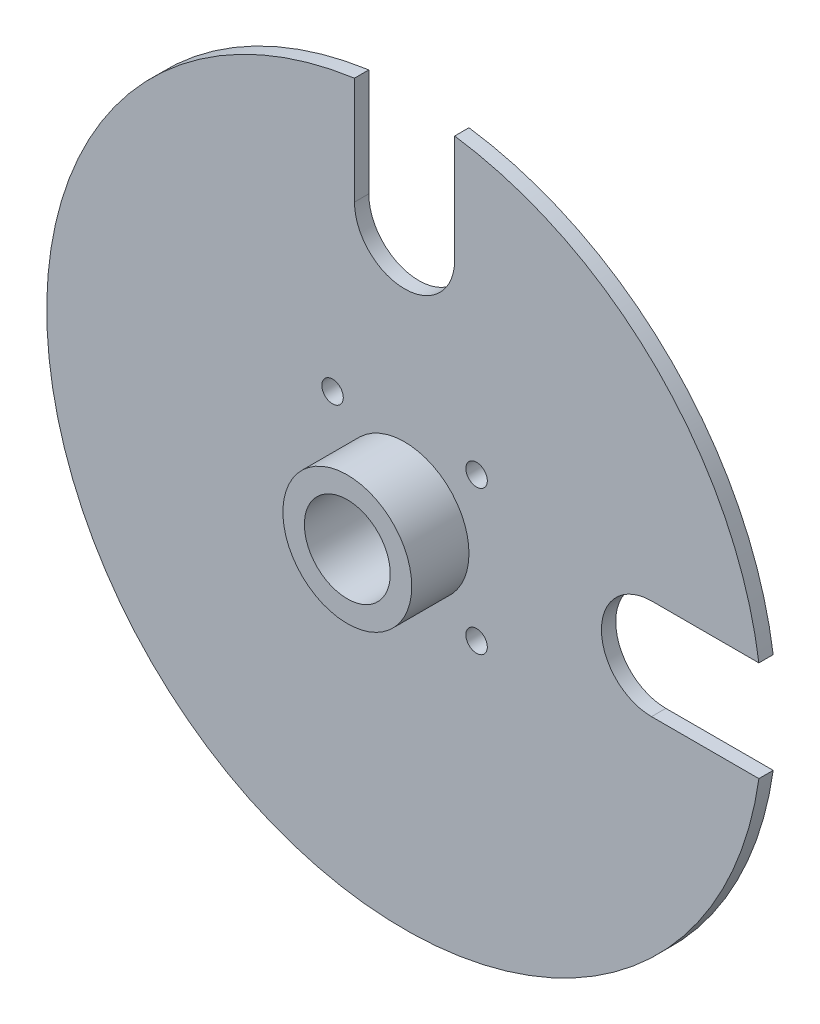
ISO-10303-21;
HEADER;
FILE_DESCRIPTION(('STEP AP214'),'2;1');
FILE_NAME('part.step','',(''),(''),'','','');
FILE_SCHEMA(('AUTOMOTIVE_DESIGN { 1 0 10303 214 1 1 1 1 }'));
ENDSEC;
DATA;
#1=APPLICATION_CONTEXT('core data for automotive mechanical design processes');
#2=APPLICATION_PROTOCOL_DEFINITION('international standard','automotive_design',2000,#1);
#3=PRODUCT_CONTEXT('',#1,'mechanical');
#4=PRODUCT('Part','Part','',(#3));
#5=PRODUCT_RELATED_PRODUCT_CATEGORY('part','',(#4));
#6=PRODUCT_DEFINITION_FORMATION('','',#4);
#7=PRODUCT_DEFINITION_CONTEXT('part definition',#1,'design');
#8=PRODUCT_DEFINITION('design','',#6,#7);
#9=PRODUCT_DEFINITION_SHAPE('','',#8);
#10=(LENGTH_UNIT() NAMED_UNIT(*) SI_UNIT(.MILLI.,.METRE.));
#11=(NAMED_UNIT(*) PLANE_ANGLE_UNIT() SI_UNIT($,.RADIAN.));
#12=(NAMED_UNIT(*) SI_UNIT($,.STERADIAN.) SOLID_ANGLE_UNIT());
#13=UNCERTAINTY_MEASURE_WITH_UNIT(LENGTH_MEASURE(1.E-05),#10,'distance_accuracy_value','');
#14=(GEOMETRIC_REPRESENTATION_CONTEXT(3) GLOBAL_UNCERTAINTY_ASSIGNED_CONTEXT((#13)) GLOBAL_UNIT_ASSIGNED_CONTEXT((#10,
#11,#12)) REPRESENTATION_CONTEXT('',''));
#15=CARTESIAN_POINT('',(0.,0.,0.));
#16=DIRECTION('',(0.,0.,1.));
#17=DIRECTION('',(1.,0.,0.));
#18=AXIS2_PLACEMENT_3D('',#15,#16,#17);
#19=CARTESIAN_POINT('',(0.,0.,7.));
#20=DIRECTION('',(0.,0.,-1.));
#21=DIRECTION('',(-1.,0.,0.));
#22=AXIS2_PLACEMENT_3D('',#19,#20,#21);
#23=CYLINDRICAL_SURFACE('',#22,50.);
#24=CARTESIAN_POINT('',(0.,0.,5.));
#25=DIRECTION('',(0.,0.,1.));
#26=DIRECTION('',(1.,0.,0.));
#27=AXIS2_PLACEMENT_3D('',#24,#25,#26);
#28=CIRCLE('',#27,50.);
#29=CARTESIAN_POINT('',(-7.,49.5075751779463,5.));
#30=VERTEX_POINT('',#29);
#31=CARTESIAN_POINT('',(49.5075751779447,-7.00000000001074,5.));
#32=VERTEX_POINT('',#31);
#33=EDGE_CURVE('E124',#30,#32,#28,.T.);
#34=ORIENTED_EDGE('',*,*,#33,.T.);
#35=DIRECTION('',(0.,0.,1.));
#36=VECTOR('',#35,1.);
#37=CARTESIAN_POINT('',(49.5075751779447,-7.00000000001074,5.));
#38=LINE('',#37,#36);
#39=CARTESIAN_POINT('',(49.5075751779447,-7.00000000001074,7.));
#40=VERTEX_POINT('',#39);
#41=EDGE_CURVE('E200',#32,#40,#38,.T.);
#42=ORIENTED_EDGE('',*,*,#41,.T.);
#43=CARTESIAN_POINT('',(0.,0.,7.));
#44=DIRECTION('',(0.,0.,1.));
#45=DIRECTION('',(1.,0.,0.));
#46=AXIS2_PLACEMENT_3D('',#43,#44,#45);
#47=CIRCLE('',#46,50.);
#48=CARTESIAN_POINT('',(-7.,49.5075751779463,7.));
#49=VERTEX_POINT('',#48);
#50=EDGE_CURVE('E132',#49,#40,#47,.T.);
#51=ORIENTED_EDGE('',*,*,#50,.F.);
#52=DIRECTION('',(0.,0.,1.));
#53=VECTOR('',#52,1.);
#54=CARTESIAN_POINT('',(-7.,49.5075751779463,5.));
#55=LINE('',#54,#53);
#56=EDGE_CURVE('E58',#30,#49,#55,.T.);
#57=ORIENTED_EDGE('',*,*,#56,.F.);
#58=EDGE_LOOP('',(#34,#42,#51,#57));
#59=FACE_BOUND('',#58,.T.);
#60=ADVANCED_FACE('F33',(#59),#23,.T.);
#61=CARTESIAN_POINT('',(0.,0.,0.));
#62=DIRECTION('',(0.,0.,1.));
#63=DIRECTION('',(1.,0.,0.));
#64=AXIS2_PLACEMENT_3D('',#61,#62,#63);
#65=PLANE('',#64);
#66=CARTESIAN_POINT('',(0.,0.,0.));
#67=DIRECTION('',(0.,0.,1.));
#68=DIRECTION('',(1.,0.,0.));
#69=AXIS2_PLACEMENT_3D('',#66,#67,#68);
#70=CIRCLE('',#69,20.);
#71=CARTESIAN_POINT('',(20.,0.,0.));
#72=VERTEX_POINT('',#71);
#73=EDGE_CURVE('E42',#72,#72,#70,.T.);
#74=ORIENTED_EDGE('',*,*,#73,.F.);
#75=EDGE_LOOP('',(#74));
#76=FACE_BOUND('',#75,.T.);
#77=CARTESIAN_POINT('',(0.,0.,0.));
#78=DIRECTION('',(0.,0.,1.));
#79=DIRECTION('',(1.,0.,0.));
#80=AXIS2_PLACEMENT_3D('',#77,#78,#79);
#81=CIRCLE('',#80,6.);
#82=CARTESIAN_POINT('',(6.,0.,0.));
#83=VERTEX_POINT('',#82);
#84=EDGE_CURVE('E152',#83,#83,#81,.T.);
#85=ORIENTED_EDGE('',*,*,#84,.T.);
#86=EDGE_LOOP('',(#85));
#87=FACE_BOUND('',#86,.T.);
#88=CARTESIAN_POINT('',(-10.0619514030223,10.0619514030222,0.));
#89=DIRECTION('',(0.,0.,1.));
#90=DIRECTION('',(1.,0.,0.));
#91=AXIS2_PLACEMENT_3D('',#88,#89,#90);
#92=CIRCLE('',#91,1.5);
#93=CARTESIAN_POINT('',(-8.56195140302228,10.0619514030222,0.));
#94=VERTEX_POINT('',#93);
#95=EDGE_CURVE('E149',#94,#94,#92,.T.);
#96=ORIENTED_EDGE('',*,*,#95,.T.);
#97=EDGE_LOOP('',(#96));
#98=FACE_BOUND('',#97,.T.);
#99=CARTESIAN_POINT('',(10.0619514030223,10.0619514030222,0.));
#100=DIRECTION('',(0.,0.,1.));
#101=DIRECTION('',(-1.,0.,0.));
#102=AXIS2_PLACEMENT_3D('',#99,#100,#101);
#103=CIRCLE('',#102,1.5);
#104=CARTESIAN_POINT('',(8.56195140302228,10.0619514030222,0.));
#105=VERTEX_POINT('',#104);
#106=EDGE_CURVE('E146',#105,#105,#103,.T.);
#107=ORIENTED_EDGE('',*,*,#106,.T.);
#108=EDGE_LOOP('',(#107));
#109=FACE_BOUND('',#108,.T.);
#110=CARTESIAN_POINT('',(10.0619514030223,-10.0619514030222,0.));
#111=DIRECTION('',(0.,0.,1.));
#112=DIRECTION('',(1.,0.,0.));
#113=AXIS2_PLACEMENT_3D('',#110,#111,#112);
#114=CIRCLE('',#113,1.5);
#115=CARTESIAN_POINT('',(11.5619514030223,-10.0619514030222,0.));
#116=VERTEX_POINT('',#115);
#117=EDGE_CURVE('E143',#116,#116,#114,.T.);
#118=ORIENTED_EDGE('',*,*,#117,.T.);
#119=EDGE_LOOP('',(#118));
#120=FACE_BOUND('',#119,.T.);
#121=CARTESIAN_POINT('',(-10.0619514030223,-10.0619514030222,0.));
#122=DIRECTION('',(0.,0.,1.));
#123=DIRECTION('',(-1.,0.,0.));
#124=AXIS2_PLACEMENT_3D('',#121,#122,#123);
#125=CIRCLE('',#124,1.5);
#126=CARTESIAN_POINT('',(-11.5619514030223,-10.0619514030222,0.));
#127=VERTEX_POINT('',#126);
#128=EDGE_CURVE('E140',#127,#127,#125,.T.);
#129=ORIENTED_EDGE('',*,*,#128,.T.);
#130=EDGE_LOOP('',(#129));
#131=FACE_BOUND('',#130,.T.);
#132=ADVANCED_FACE('F158',(#76,#87,#98,#109,#120,#131),#65,.F.);
#133=CARTESIAN_POINT('',(0.,0.,5.));
#134=DIRECTION('',(0.,0.,-1.));
#135=DIRECTION('',(-1.,0.,0.));
#136=AXIS2_PLACEMENT_3D('',#133,#134,#135);
#137=CYLINDRICAL_SURFACE('',#136,20.);
#138=CARTESIAN_POINT('',(0.,0.,5.));
#139=DIRECTION('',(0.,0.,1.));
#140=DIRECTION('',(1.,0.,0.));
#141=AXIS2_PLACEMENT_3D('',#138,#139,#140);
#142=CIRCLE('',#141,20.);
#143=CARTESIAN_POINT('',(20.,0.,5.));
#144=VERTEX_POINT('',#143);
#145=EDGE_CURVE('E11',#144,#144,#142,.T.);
#146=ORIENTED_EDGE('',*,*,#145,.F.);
#147=EDGE_LOOP('',(#146));
#148=FACE_BOUND('',#147,.T.);
#149=ORIENTED_EDGE('',*,*,#73,.T.);
#150=EDGE_LOOP('',(#149));
#151=FACE_BOUND('',#150,.T.);
#152=ADVANCED_FACE('F35',(#148,#151),#137,.T.);
#153=CARTESIAN_POINT('',(0.,0.,5.));
#154=DIRECTION('',(0.,0.,-1.));
#155=DIRECTION('',(-1.,0.,0.));
#156=AXIS2_PLACEMENT_3D('',#153,#154,#155);
#157=CYLINDRICAL_SURFACE('',#156,6.);
#158=CARTESIAN_POINT('',(0.,0.,15.));
#159=DIRECTION('',(0.,0.,1.));
#160=DIRECTION('',(1.,0.,0.));
#161=AXIS2_PLACEMENT_3D('',#158,#159,#160);
#162=CIRCLE('',#161,6.);
#163=CARTESIAN_POINT('',(6.,0.,15.));
#164=VERTEX_POINT('',#163);
#165=EDGE_CURVE('E134',#164,#164,#162,.T.);
#166=ORIENTED_EDGE('',*,*,#165,.T.);
#167=EDGE_LOOP('',(#166));
#168=FACE_BOUND('',#167,.T.);
#169=ORIENTED_EDGE('',*,*,#84,.F.);
#170=EDGE_LOOP('',(#169));
#171=FACE_BOUND('',#170,.T.);
#172=ADVANCED_FACE('F275',(#168,#171),#157,.F.);
#173=CARTESIAN_POINT('',(-10.0619514030223,10.0619514030222,5.));
#174=DIRECTION('',(0.,0.,-1.));
#175=DIRECTION('',(-1.,0.,0.));
#176=AXIS2_PLACEMENT_3D('',#173,#174,#175);
#177=CYLINDRICAL_SURFACE('',#176,1.5);
#178=ORIENTED_EDGE('',*,*,#95,.F.);
#179=EDGE_LOOP('',(#178));
#180=FACE_BOUND('',#179,.T.);
#181=CARTESIAN_POINT('',(-10.0619514030223,10.0619514030222,7.));
#182=DIRECTION('',(0.,0.,1.));
#183=DIRECTION('',(1.,0.,0.));
#184=AXIS2_PLACEMENT_3D('',#181,#182,#183);
#185=CIRCLE('',#184,1.5);
#186=CARTESIAN_POINT('',(-8.56195140302228,10.0619514030222,7.));
#187=VERTEX_POINT('',#186);
#188=EDGE_CURVE('E188',#187,#187,#185,.T.);
#189=ORIENTED_EDGE('',*,*,#188,.T.);
#190=EDGE_LOOP('',(#189));
#191=FACE_BOUND('',#190,.T.);
#192=ADVANCED_FACE('F271',(#180,#191),#177,.F.);
#193=CARTESIAN_POINT('',(10.0619514030223,10.0619514030222,5.));
#194=DIRECTION('',(0.,0.,-1.));
#195=DIRECTION('',(-1.,0.,0.));
#196=AXIS2_PLACEMENT_3D('',#193,#194,#195);
#197=CYLINDRICAL_SURFACE('',#196,1.5);
#198=ORIENTED_EDGE('',*,*,#106,.F.);
#199=EDGE_LOOP('',(#198));
#200=FACE_BOUND('',#199,.T.);
#201=CARTESIAN_POINT('',(10.0619514030223,10.0619514030222,7.));
#202=DIRECTION('',(0.,0.,1.));
#203=DIRECTION('',(1.,0.,0.));
#204=AXIS2_PLACEMENT_3D('',#201,#202,#203);
#205=CIRCLE('',#204,1.5);
#206=CARTESIAN_POINT('',(11.5619514030223,10.0619514030222,7.));
#207=VERTEX_POINT('',#206);
#208=EDGE_CURVE('E181',#207,#207,#205,.T.);
#209=ORIENTED_EDGE('',*,*,#208,.T.);
#210=EDGE_LOOP('',(#209));
#211=FACE_BOUND('',#210,.T.);
#212=ADVANCED_FACE('F267',(#200,#211),#197,.F.);
#213=CARTESIAN_POINT('',(10.0619514030223,-10.0619514030222,5.));
#214=DIRECTION('',(0.,0.,-1.));
#215=DIRECTION('',(-1.,0.,0.));
#216=AXIS2_PLACEMENT_3D('',#213,#214,#215);
#217=CYLINDRICAL_SURFACE('',#216,1.5);
#218=ORIENTED_EDGE('',*,*,#117,.F.);
#219=EDGE_LOOP('',(#218));
#220=FACE_BOUND('',#219,.T.);
#221=CARTESIAN_POINT('',(10.0619514030223,-10.0619514030222,7.));
#222=DIRECTION('',(0.,0.,1.));
#223=DIRECTION('',(1.,0.,0.));
#224=AXIS2_PLACEMENT_3D('',#221,#222,#223);
#225=CIRCLE('',#224,1.5);
#226=CARTESIAN_POINT('',(11.5619514030223,-10.0619514030222,7.));
#227=VERTEX_POINT('',#226);
#228=EDGE_CURVE('E182',#227,#227,#225,.T.);
#229=ORIENTED_EDGE('',*,*,#228,.T.);
#230=EDGE_LOOP('',(#229));
#231=FACE_BOUND('',#230,.T.);
#232=ADVANCED_FACE('F175',(#220,#231),#217,.F.);
#233=CARTESIAN_POINT('',(-10.0619514030223,-10.0619514030222,5.));
#234=DIRECTION('',(0.,0.,-1.));
#235=DIRECTION('',(-1.,0.,0.));
#236=AXIS2_PLACEMENT_3D('',#233,#234,#235);
#237=CYLINDRICAL_SURFACE('',#236,1.5);
#238=ORIENTED_EDGE('',*,*,#128,.F.);
#239=EDGE_LOOP('',(#238));
#240=FACE_BOUND('',#239,.T.);
#241=CARTESIAN_POINT('',(-10.0619514030223,-10.0619514030222,7.));
#242=DIRECTION('',(0.,0.,1.));
#243=DIRECTION('',(1.,0.,0.));
#244=AXIS2_PLACEMENT_3D('',#241,#242,#243);
#245=CIRCLE('',#244,1.5);
#246=CARTESIAN_POINT('',(-8.56195140302228,-10.0619514030222,7.));
#247=VERTEX_POINT('',#246);
#248=EDGE_CURVE('E179',#247,#247,#245,.T.);
#249=ORIENTED_EDGE('',*,*,#248,.T.);
#250=EDGE_LOOP('',(#249));
#251=FACE_BOUND('',#250,.T.);
#252=ADVANCED_FACE('F171',(#240,#251),#237,.F.);
#253=CARTESIAN_POINT('',(0.,0.,15.));
#254=DIRECTION('',(0.,0.,1.));
#255=DIRECTION('',(1.,0.,0.));
#256=AXIS2_PLACEMENT_3D('',#253,#254,#255);
#257=PLANE('',#256);
#258=CARTESIAN_POINT('',(0.,0.,15.));
#259=DIRECTION('',(0.,0.,1.));
#260=DIRECTION('',(1.,0.,0.));
#261=AXIS2_PLACEMENT_3D('',#258,#259,#260);
#262=CIRCLE('',#261,9.);
#263=CARTESIAN_POINT('',(9.,0.,15.));
#264=VERTEX_POINT('',#263);
#265=EDGE_CURVE('E137',#264,#264,#262,.T.);
#266=ORIENTED_EDGE('',*,*,#265,.T.);
#267=EDGE_LOOP('',(#266));
#268=FACE_BOUND('',#267,.T.);
#269=ORIENTED_EDGE('',*,*,#165,.F.);
#270=EDGE_LOOP('',(#269));
#271=FACE_BOUND('',#270,.T.);
#272=ADVANCED_FACE('F174',(#268,#271),#257,.T.);
#273=CARTESIAN_POINT('',(0.,0.,15.));
#274=DIRECTION('',(0.,0.,-1.));
#275=DIRECTION('',(-1.,0.,0.));
#276=AXIS2_PLACEMENT_3D('',#273,#274,#275);
#277=CYLINDRICAL_SURFACE('',#276,9.);
#278=CARTESIAN_POINT('',(0.,0.,7.));
#279=DIRECTION('',(0.,0.,1.));
#280=DIRECTION('',(1.,0.,0.));
#281=AXIS2_PLACEMENT_3D('',#278,#279,#280);
#282=CIRCLE('',#281,9.);
#283=CARTESIAN_POINT('',(9.,0.,7.));
#284=VERTEX_POINT('',#283);
#285=EDGE_CURVE('E37',#284,#284,#282,.T.);
#286=ORIENTED_EDGE('',*,*,#285,.T.);
#287=EDGE_LOOP('',(#286));
#288=FACE_BOUND('',#287,.T.);
#289=ORIENTED_EDGE('',*,*,#265,.F.);
#290=EDGE_LOOP('',(#289));
#291=FACE_BOUND('',#290,.T.);
#292=ADVANCED_FACE('F241',(#288,#291),#277,.T.);
#293=CARTESIAN_POINT('',(0.,0.,5.));
#294=DIRECTION('',(0.,0.,1.));
#295=DIRECTION('',(1.,0.,0.));
#296=AXIS2_PLACEMENT_3D('',#293,#294,#295);
#297=PLANE('',#296);
#298=ORIENTED_EDGE('',*,*,#145,.T.);
#299=EDGE_LOOP('',(#298));
#300=FACE_BOUND('',#299,.T.);
#301=CARTESIAN_POINT('',(34.5075751779463,-7.4804405753469E-12,5.));
#302=DIRECTION('',(0.,0.,1.));
#303=DIRECTION('',(1.,0.,0.));
#304=AXIS2_PLACEMENT_3D('',#301,#302,#303);
#305=CIRCLE('',#304,7.);
#306=CARTESIAN_POINT('',(34.5075751779478,6.99999999999252,5.));
#307=VERTEX_POINT('',#306);
#308=CARTESIAN_POINT('',(34.5075751779447,-7.00000000000748,5.));
#309=VERTEX_POINT('',#308);
#310=EDGE_CURVE('E107',#307,#309,#305,.T.);
#311=ORIENTED_EDGE('',*,*,#310,.T.);
#312=DIRECTION('',(1.,-2.17013906844699E-13,0.));
#313=VECTOR('',#312,1.);
#314=CARTESIAN_POINT('',(49.5075751779447,-7.00000000001074,5.));
#315=LINE('',#314,#313);
#316=EDGE_CURVE('E117',#309,#32,#315,.T.);
#317=ORIENTED_EDGE('',*,*,#316,.T.);
#318=ORIENTED_EDGE('',*,*,#33,.F.);
#319=DIRECTION('',(0.,-1.,0.));
#320=VECTOR('',#319,1.);
#321=CARTESIAN_POINT('',(-7.,49.5075751779463,5.));
#322=LINE('',#321,#320);
#323=CARTESIAN_POINT('',(-7.,34.5075751779463,5.));
#324=VERTEX_POINT('',#323);
#325=EDGE_CURVE('E207',#30,#324,#322,.T.);
#326=ORIENTED_EDGE('',*,*,#325,.T.);
#327=CARTESIAN_POINT('',(0.,34.5075751779463,5.));
#328=DIRECTION('',(0.,0.,1.));
#329=DIRECTION('',(1.,0.,0.));
#330=AXIS2_PLACEMENT_3D('',#327,#328,#329);
#331=CIRCLE('',#330,7.);
#332=CARTESIAN_POINT('',(6.99999999999999,34.5075751779463,5.));
#333=VERTEX_POINT('',#332);
#334=EDGE_CURVE('E210',#324,#333,#331,.T.);
#335=ORIENTED_EDGE('',*,*,#334,.T.);
#336=DIRECTION('',(0.,1.,0.));
#337=VECTOR('',#336,1.);
#338=CARTESIAN_POINT('',(7.,49.5075751779463,5.));
#339=LINE('',#338,#337);
#340=CARTESIAN_POINT('',(7.,49.5075751779463,5.));
#341=VERTEX_POINT('',#340);
#342=EDGE_CURVE('E123',#333,#341,#339,.T.);
#343=ORIENTED_EDGE('',*,*,#342,.T.);
#344=CARTESIAN_POINT('',(49.5075751779478,6.99999999998926,5.));
#345=VERTEX_POINT('',#344);
#346=EDGE_CURVE('E114',#345,#341,#28,.T.);
#347=ORIENTED_EDGE('',*,*,#346,.F.);
#348=DIRECTION('',(-1.,2.16782610381235E-13,0.));
#349=VECTOR('',#348,1.);
#350=CARTESIAN_POINT('',(49.5075751779478,6.99999999998926,5.));
#351=LINE('',#350,#349);
#352=EDGE_CURVE('E100',#345,#307,#351,.T.);
#353=ORIENTED_EDGE('',*,*,#352,.T.);
#354=EDGE_LOOP('',(#311,#317,#318,#326,#335,#343,#347,#353));
#355=FACE_BOUND('',#354,.T.);
#356=ADVANCED_FACE('F120',(#300,#355),#297,.F.);
#357=CARTESIAN_POINT('',(49.5075751779478,6.99999999998926,7.));
#358=VERTEX_POINT('',#357);
#359=CARTESIAN_POINT('',(7.,49.5075751779463,7.));
#360=VERTEX_POINT('',#359);
#361=EDGE_CURVE('E116',#358,#360,#47,.T.);
#362=ORIENTED_EDGE('',*,*,#361,.F.);
#363=DIRECTION('',(0.,0.,1.));
#364=VECTOR('',#363,1.);
#365=CARTESIAN_POINT('',(49.5075751779478,6.99999999998926,5.));
#366=LINE('',#365,#364);
#367=EDGE_CURVE('E50',#345,#358,#366,.T.);
#368=ORIENTED_EDGE('',*,*,#367,.F.);
#369=ORIENTED_EDGE('',*,*,#346,.T.);
#370=DIRECTION('',(0.,0.,1.));
#371=VECTOR('',#370,1.);
#372=CARTESIAN_POINT('',(7.,49.5075751779463,5.));
#373=LINE('',#372,#371);
#374=EDGE_CURVE('E125',#341,#360,#373,.T.);
#375=ORIENTED_EDGE('',*,*,#374,.T.);
#376=EDGE_LOOP('',(#362,#368,#369,#375));
#377=FACE_BOUND('',#376,.T.);
#378=ADVANCED_FACE('F112',(#377),#23,.T.);
#379=CARTESIAN_POINT('',(0.,0.,7.));
#380=DIRECTION('',(0.,0.,1.));
#381=DIRECTION('',(1.,0.,0.));
#382=AXIS2_PLACEMENT_3D('',#379,#380,#381);
#383=PLANE('',#382);
#384=ORIENTED_EDGE('',*,*,#228,.F.);
#385=EDGE_LOOP('',(#384));
#386=FACE_BOUND('',#385,.T.);
#387=ORIENTED_EDGE('',*,*,#188,.F.);
#388=EDGE_LOOP('',(#387));
#389=FACE_BOUND('',#388,.T.);
#390=ORIENTED_EDGE('',*,*,#248,.F.);
#391=EDGE_LOOP('',(#390));
#392=FACE_BOUND('',#391,.T.);
#393=ORIENTED_EDGE('',*,*,#208,.F.);
#394=EDGE_LOOP('',(#393));
#395=FACE_BOUND('',#394,.T.);
#396=DIRECTION('',(1.,-2.17013906844699E-13,0.));
#397=VECTOR('',#396,1.);
#398=CARTESIAN_POINT('',(49.5075751779447,-7.00000000001074,7.));
#399=LINE('',#398,#397);
#400=CARTESIAN_POINT('',(34.5075751779447,-7.00000000000748,7.));
#401=VERTEX_POINT('',#400);
#402=EDGE_CURVE('E108',#401,#40,#399,.T.);
#403=ORIENTED_EDGE('',*,*,#402,.F.);
#404=CARTESIAN_POINT('',(34.5075751779463,-7.4804405753469E-12,7.));
#405=DIRECTION('',(0.,0.,1.));
#406=DIRECTION('',(1.,0.,0.));
#407=AXIS2_PLACEMENT_3D('',#404,#405,#406);
#408=CIRCLE('',#407,7.);
#409=CARTESIAN_POINT('',(34.5075751779478,6.99999999999252,7.));
#410=VERTEX_POINT('',#409);
#411=EDGE_CURVE('E196',#410,#401,#408,.T.);
#412=ORIENTED_EDGE('',*,*,#411,.F.);
#413=DIRECTION('',(-1.,2.16782610381235E-13,0.));
#414=VECTOR('',#413,1.);
#415=CARTESIAN_POINT('',(49.5075751779478,6.99999999998926,7.));
#416=LINE('',#415,#414);
#417=EDGE_CURVE('E185',#358,#410,#416,.T.);
#418=ORIENTED_EDGE('',*,*,#417,.F.);
#419=ORIENTED_EDGE('',*,*,#361,.T.);
#420=DIRECTION('',(0.,1.,0.));
#421=VECTOR('',#420,1.);
#422=CARTESIAN_POINT('',(7.,49.5075751779463,7.));
#423=LINE('',#422,#421);
#424=CARTESIAN_POINT('',(6.99999999999999,34.5075751779463,7.));
#425=VERTEX_POINT('',#424);
#426=EDGE_CURVE('E211',#425,#360,#423,.T.);
#427=ORIENTED_EDGE('',*,*,#426,.F.);
#428=CARTESIAN_POINT('',(0.,34.5075751779463,7.));
#429=DIRECTION('',(0.,0.,1.));
#430=DIRECTION('',(1.,0.,0.));
#431=AXIS2_PLACEMENT_3D('',#428,#429,#430);
#432=CIRCLE('',#431,7.);
#433=CARTESIAN_POINT('',(-7.,34.5075751779463,7.));
#434=VERTEX_POINT('',#433);
#435=EDGE_CURVE('E215',#434,#425,#432,.T.);
#436=ORIENTED_EDGE('',*,*,#435,.F.);
#437=DIRECTION('',(0.,-1.,0.));
#438=VECTOR('',#437,1.);
#439=CARTESIAN_POINT('',(-7.,49.5075751779463,7.));
#440=LINE('',#439,#438);
#441=EDGE_CURVE('E203',#49,#434,#440,.T.);
#442=ORIENTED_EDGE('',*,*,#441,.F.);
#443=ORIENTED_EDGE('',*,*,#50,.T.);
#444=EDGE_LOOP('',(#403,#412,#418,#419,#427,#436,#442,#443));
#445=FACE_BOUND('',#444,.T.);
#446=ORIENTED_EDGE('',*,*,#285,.F.);
#447=EDGE_LOOP('',(#446));
#448=FACE_BOUND('',#447,.T.);
#449=ADVANCED_FACE('F232',(#386,#389,#392,#395,#445,#448),#383,.T.);
#450=CARTESIAN_POINT('',(7.,49.5075751779463,5.));
#451=DIRECTION('',(1.,0.,0.));
#452=DIRECTION('',(0.,1.,0.));
#453=AXIS2_PLACEMENT_3D('',#450,#451,#452);
#454=PLANE('',#453);
#455=ORIENTED_EDGE('',*,*,#426,.T.);
#456=ORIENTED_EDGE('',*,*,#374,.F.);
#457=ORIENTED_EDGE('',*,*,#342,.F.);
#458=DIRECTION('',(0.,0.,1.));
#459=VECTOR('',#458,1.);
#460=CARTESIAN_POINT('',(6.99999999999999,34.5075751779463,5.));
#461=LINE('',#460,#459);
#462=EDGE_CURVE('E128',#333,#425,#461,.T.);
#463=ORIENTED_EDGE('',*,*,#462,.T.);
#464=EDGE_LOOP('',(#455,#456,#457,#463));
#465=FACE_BOUND('',#464,.T.);
#466=ADVANCED_FACE('F235',(#465),#454,.F.);
#467=CARTESIAN_POINT('',(0.,34.5075751779463,5.));
#468=DIRECTION('',(0.,0.,1.));
#469=DIRECTION('',(1.,0.,0.));
#470=AXIS2_PLACEMENT_3D('',#467,#468,#469);
#471=CYLINDRICAL_SURFACE('',#470,7.);
#472=ORIENTED_EDGE('',*,*,#435,.T.);
#473=ORIENTED_EDGE('',*,*,#462,.F.);
#474=ORIENTED_EDGE('',*,*,#334,.F.);
#475=DIRECTION('',(0.,0.,1.));
#476=VECTOR('',#475,1.);
#477=CARTESIAN_POINT('',(-7.,34.5075751779463,5.));
#478=LINE('',#477,#476);
#479=EDGE_CURVE('E221',#324,#434,#478,.T.);
#480=ORIENTED_EDGE('',*,*,#479,.T.);
#481=EDGE_LOOP('',(#472,#473,#474,#480));
#482=FACE_BOUND('',#481,.T.);
#483=ADVANCED_FACE('F224',(#482),#471,.F.);
#484=CARTESIAN_POINT('',(-7.,49.5075751779463,5.));
#485=DIRECTION('',(-1.,0.,0.));
#486=DIRECTION('',(0.,-1.,0.));
#487=AXIS2_PLACEMENT_3D('',#484,#485,#486);
#488=PLANE('',#487);
#489=ORIENTED_EDGE('',*,*,#441,.T.);
#490=ORIENTED_EDGE('',*,*,#479,.F.);
#491=ORIENTED_EDGE('',*,*,#325,.F.);
#492=ORIENTED_EDGE('',*,*,#56,.T.);
#493=EDGE_LOOP('',(#489,#490,#491,#492));
#494=FACE_BOUND('',#493,.T.);
#495=ADVANCED_FACE('F227',(#494),#488,.F.);
#496=CARTESIAN_POINT('',(49.5075751779447,-7.00000000001074,5.));
#497=DIRECTION('',(-2.17013906844699E-13,-1.,0.));
#498=DIRECTION('',(1.,-2.17013906844699E-13,0.));
#499=AXIS2_PLACEMENT_3D('',#496,#497,#498);
#500=PLANE('',#499);
#501=ORIENTED_EDGE('',*,*,#402,.T.);
#502=ORIENTED_EDGE('',*,*,#41,.F.);
#503=ORIENTED_EDGE('',*,*,#316,.F.);
#504=DIRECTION('',(0.,0.,1.));
#505=VECTOR('',#504,1.);
#506=CARTESIAN_POINT('',(34.5075751779447,-7.00000000000748,5.));
#507=LINE('',#506,#505);
#508=EDGE_CURVE('E204',#309,#401,#507,.T.);
#509=ORIENTED_EDGE('',*,*,#508,.T.);
#510=EDGE_LOOP('',(#501,#502,#503,#509));
#511=FACE_BOUND('',#510,.T.);
#512=ADVANCED_FACE('F324',(#511),#500,.F.);
#513=CARTESIAN_POINT('',(34.5075751779463,-7.4804405753469E-12,5.));
#514=DIRECTION('',(0.,0.,1.));
#515=DIRECTION('',(1.,0.,0.));
#516=AXIS2_PLACEMENT_3D('',#513,#514,#515);
#517=CYLINDRICAL_SURFACE('',#516,7.);
#518=ORIENTED_EDGE('',*,*,#411,.T.);
#519=ORIENTED_EDGE('',*,*,#508,.F.);
#520=ORIENTED_EDGE('',*,*,#310,.F.);
#521=DIRECTION('',(0.,0.,1.));
#522=VECTOR('',#521,1.);
#523=CARTESIAN_POINT('',(34.5075751779478,6.99999999999252,5.));
#524=LINE('',#523,#522);
#525=EDGE_CURVE('E102',#307,#410,#524,.T.);
#526=ORIENTED_EDGE('',*,*,#525,.T.);
#527=EDGE_LOOP('',(#518,#519,#520,#526));
#528=FACE_BOUND('',#527,.T.);
#529=ADVANCED_FACE('F332',(#528),#517,.F.);
#530=CARTESIAN_POINT('',(49.5075751779478,6.99999999998926,5.));
#531=DIRECTION('',(2.16782610381235E-13,1.,0.));
#532=DIRECTION('',(-1.,2.16782610381235E-13,0.));
#533=AXIS2_PLACEMENT_3D('',#530,#531,#532);
#534=PLANE('',#533);
#535=ORIENTED_EDGE('',*,*,#417,.T.);
#536=ORIENTED_EDGE('',*,*,#525,.F.);
#537=ORIENTED_EDGE('',*,*,#352,.F.);
#538=ORIENTED_EDGE('',*,*,#367,.T.);
#539=EDGE_LOOP('',(#535,#536,#537,#538));
#540=FACE_BOUND('',#539,.T.);
#541=ADVANCED_FACE('F101',(#540),#534,.F.);
#542=CLOSED_SHELL('',(#60,#132,#152,#172,#192,#212,#232,#252,#272,#292,#356,#378,#449,#466,#483,
#495,#512,#529,#541));
#543=MANIFOLD_SOLID_BREP('B2',#542);
#544=ADVANCED_BREP_SHAPE_REPRESENTATION('',(#18,#543),#14);
#545=SHAPE_DEFINITION_REPRESENTATION(#9,#544);
ENDSEC;
END-ISO-10303-21;
